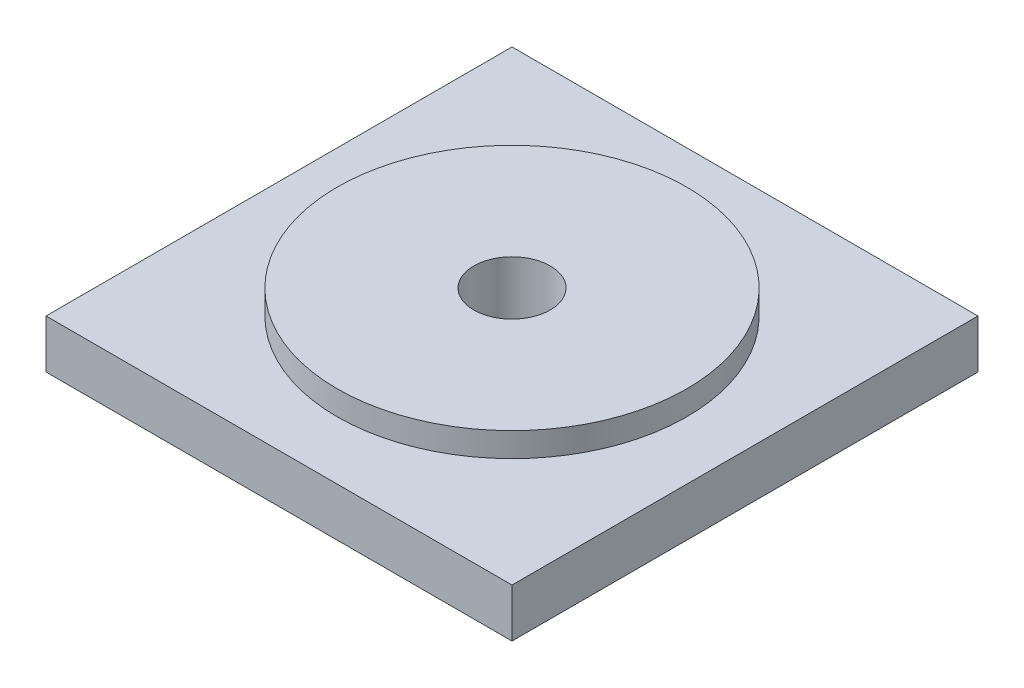
ISO-10303-21;
HEADER;
FILE_DESCRIPTION(('STEP AP214'),'2;1');
FILE_NAME('part.step','',(''),(''),'','','');
FILE_SCHEMA(('AUTOMOTIVE_DESIGN { 1 0 10303 214 1 1 1 1 }'));
ENDSEC;
DATA;
#1=APPLICATION_CONTEXT('core data for automotive mechanical design processes');
#2=APPLICATION_PROTOCOL_DEFINITION('international standard','automotive_design',2000,#1);
#3=PRODUCT_CONTEXT('',#1,'mechanical');
#4=PRODUCT('Part','Part','',(#3));
#5=PRODUCT_RELATED_PRODUCT_CATEGORY('part','',(#4));
#6=PRODUCT_DEFINITION_FORMATION('','',#4);
#7=PRODUCT_DEFINITION_CONTEXT('part definition',#1,'design');
#8=PRODUCT_DEFINITION('design','',#6,#7);
#9=PRODUCT_DEFINITION_SHAPE('','',#8);
#10=(LENGTH_UNIT() NAMED_UNIT(*) SI_UNIT(.MILLI.,.METRE.));
#11=(NAMED_UNIT(*) PLANE_ANGLE_UNIT() SI_UNIT($,.RADIAN.));
#12=(NAMED_UNIT(*) SI_UNIT($,.STERADIAN.) SOLID_ANGLE_UNIT());
#13=UNCERTAINTY_MEASURE_WITH_UNIT(LENGTH_MEASURE(1.E-05),#10,'distance_accuracy_value','');
#14=(GEOMETRIC_REPRESENTATION_CONTEXT(3) GLOBAL_UNCERTAINTY_ASSIGNED_CONTEXT((#13)) GLOBAL_UNIT_ASSIGNED_CONTEXT((#10,
#11,#12)) REPRESENTATION_CONTEXT('',''));
#15=CARTESIAN_POINT('',(0.,0.,0.));
#16=DIRECTION('',(0.,0.,1.));
#17=DIRECTION('',(1.,0.,0.));
#18=AXIS2_PLACEMENT_3D('',#15,#16,#17);
#19=CARTESIAN_POINT('',(0.,2.54,0.));
#20=DIRECTION('',(1.,0.,0.));
#21=DIRECTION('',(0.,0.,-1.));
#22=AXIS2_PLACEMENT_3D('',#19,#20,#21);
#23=PLANE('',#22);
#24=DIRECTION('',(0.,0.,1.));
#25=VECTOR('',#24,1.);
#26=CARTESIAN_POINT('',(0.,0.,0.));
#27=LINE('',#26,#25);
#28=CARTESIAN_POINT('',(0.,0.,0.));
#29=VERTEX_POINT('',#28);
#30=CARTESIAN_POINT('',(0.,0.,24.384));
#31=VERTEX_POINT('',#30);
#32=EDGE_CURVE('E99',#29,#31,#27,.T.);
#33=ORIENTED_EDGE('',*,*,#32,.T.);
#34=DIRECTION('',(0.,-1.,0.));
#35=VECTOR('',#34,1.);
#36=CARTESIAN_POINT('',(0.,2.54,24.384));
#37=LINE('',#36,#35);
#38=CARTESIAN_POINT('',(0.,2.54,24.384));
#39=VERTEX_POINT('',#38);
#40=EDGE_CURVE('E36',#39,#31,#37,.T.);
#41=ORIENTED_EDGE('',*,*,#40,.F.);
#42=DIRECTION('',(0.,0.,1.));
#43=VECTOR('',#42,1.);
#44=CARTESIAN_POINT('',(0.,2.54,0.));
#45=LINE('',#44,#43);
#46=CARTESIAN_POINT('',(0.,2.54,0.));
#47=VERTEX_POINT('',#46);
#48=EDGE_CURVE('E86',#47,#39,#45,.T.);
#49=ORIENTED_EDGE('',*,*,#48,.F.);
#50=DIRECTION('',(0.,-1.,0.));
#51=VECTOR('',#50,1.);
#52=CARTESIAN_POINT('',(0.,2.54,0.));
#53=LINE('',#52,#51);
#54=EDGE_CURVE('E95',#47,#29,#53,.T.);
#55=ORIENTED_EDGE('',*,*,#54,.T.);
#56=EDGE_LOOP('',(#33,#41,#49,#55));
#57=FACE_BOUND('',#56,.T.);
#58=ADVANCED_FACE('F33',(#57),#23,.F.);
#59=CARTESIAN_POINT('',(0.,2.54,24.384));
#60=DIRECTION('',(0.,0.,-1.));
#61=DIRECTION('',(-1.,0.,0.));
#62=AXIS2_PLACEMENT_3D('',#59,#60,#61);
#63=PLANE('',#62);
#64=DIRECTION('',(1.,0.,0.));
#65=VECTOR('',#64,1.);
#66=CARTESIAN_POINT('',(0.,0.,24.384));
#67=LINE('',#66,#65);
#68=CARTESIAN_POINT('',(24.384,0.,24.384));
#69=VERTEX_POINT('',#68);
#70=EDGE_CURVE('E91',#31,#69,#67,.T.);
#71=ORIENTED_EDGE('',*,*,#70,.T.);
#72=DIRECTION('',(0.,-1.,0.));
#73=VECTOR('',#72,1.);
#74=CARTESIAN_POINT('',(24.384,2.54,24.384));
#75=LINE('',#74,#73);
#76=CARTESIAN_POINT('',(24.384,2.54,24.384));
#77=VERTEX_POINT('',#76);
#78=EDGE_CURVE('E89',#77,#69,#75,.T.);
#79=ORIENTED_EDGE('',*,*,#78,.F.);
#80=DIRECTION('',(1.,0.,0.));
#81=VECTOR('',#80,1.);
#82=CARTESIAN_POINT('',(0.,2.54,24.384));
#83=LINE('',#82,#81);
#84=EDGE_CURVE('E81',#39,#77,#83,.T.);
#85=ORIENTED_EDGE('',*,*,#84,.F.);
#86=ORIENTED_EDGE('',*,*,#40,.T.);
#87=EDGE_LOOP('',(#71,#79,#85,#86));
#88=FACE_BOUND('',#87,.T.);
#89=ADVANCED_FACE('F90',(#88),#63,.F.);
#90=CARTESIAN_POINT('',(24.384,2.54,0.));
#91=DIRECTION('',(-1.,0.,0.));
#92=DIRECTION('',(0.,0.,1.));
#93=AXIS2_PLACEMENT_3D('',#90,#91,#92);
#94=PLANE('',#93);
#95=DIRECTION('',(0.,0.,-1.));
#96=VECTOR('',#95,1.);
#97=CARTESIAN_POINT('',(24.384,0.,0.));
#98=LINE('',#97,#96);
#99=CARTESIAN_POINT('',(24.384,0.,0.));
#100=VERTEX_POINT('',#99);
#101=EDGE_CURVE('E67',#69,#100,#98,.T.);
#102=ORIENTED_EDGE('',*,*,#101,.T.);
#103=DIRECTION('',(0.,-1.,0.));
#104=VECTOR('',#103,1.);
#105=CARTESIAN_POINT('',(24.384,2.54,0.));
#106=LINE('',#105,#104);
#107=CARTESIAN_POINT('',(24.384,2.54,0.));
#108=VERTEX_POINT('',#107);
#109=EDGE_CURVE('E92',#108,#100,#106,.T.);
#110=ORIENTED_EDGE('',*,*,#109,.F.);
#111=DIRECTION('',(0.,0.,-1.));
#112=VECTOR('',#111,1.);
#113=CARTESIAN_POINT('',(24.384,2.54,0.));
#114=LINE('',#113,#112);
#115=EDGE_CURVE('E84',#77,#108,#114,.T.);
#116=ORIENTED_EDGE('',*,*,#115,.F.);
#117=ORIENTED_EDGE('',*,*,#78,.T.);
#118=EDGE_LOOP('',(#102,#110,#116,#117));
#119=FACE_BOUND('',#118,.T.);
#120=ADVANCED_FACE('F93',(#119),#94,.F.);
#121=CARTESIAN_POINT('',(0.,2.54,0.));
#122=DIRECTION('',(0.,0.,1.));
#123=DIRECTION('',(1.,0.,0.));
#124=AXIS2_PLACEMENT_3D('',#121,#122,#123);
#125=PLANE('',#124);
#126=DIRECTION('',(-1.,0.,0.));
#127=VECTOR('',#126,1.);
#128=CARTESIAN_POINT('',(0.,0.,0.));
#129=LINE('',#128,#127);
#130=EDGE_CURVE('E73',#100,#29,#129,.T.);
#131=ORIENTED_EDGE('',*,*,#130,.T.);
#132=ORIENTED_EDGE('',*,*,#54,.F.);
#133=DIRECTION('',(-1.,0.,0.));
#134=VECTOR('',#133,1.);
#135=CARTESIAN_POINT('',(0.,2.54,0.));
#136=LINE('',#135,#134);
#137=EDGE_CURVE('E50',#108,#47,#136,.T.);
#138=ORIENTED_EDGE('',*,*,#137,.F.);
#139=ORIENTED_EDGE('',*,*,#109,.T.);
#140=EDGE_LOOP('',(#131,#132,#138,#139));
#141=FACE_BOUND('',#140,.T.);
#142=ADVANCED_FACE('F107',(#141),#125,.F.);
#143=CARTESIAN_POINT('',(0.,2.54,0.));
#144=DIRECTION('',(0.,1.,0.));
#145=DIRECTION('',(0.,0.,1.));
#146=AXIS2_PLACEMENT_3D('',#143,#144,#145);
#147=PLANE('',#146);
#148=CARTESIAN_POINT('',(12.192,2.54,12.192));
#149=DIRECTION('',(0.,1.,0.));
#150=DIRECTION('',(0.,0.,1.));
#151=AXIS2_PLACEMENT_3D('',#148,#149,#150);
#152=CIRCLE('',#151,9.14399999999999);
#153=CARTESIAN_POINT('',(12.192,2.54,21.336));
#154=VERTEX_POINT('',#153);
#155=EDGE_CURVE('E11',#154,#154,#152,.T.);
#156=ORIENTED_EDGE('',*,*,#155,.F.);
#157=EDGE_LOOP('',(#156));
#158=FACE_BOUND('',#157,.T.);
#159=ORIENTED_EDGE('',*,*,#48,.T.);
#160=ORIENTED_EDGE('',*,*,#84,.T.);
#161=ORIENTED_EDGE('',*,*,#115,.T.);
#162=ORIENTED_EDGE('',*,*,#137,.T.);
#163=EDGE_LOOP('',(#159,#160,#161,#162));
#164=FACE_BOUND('',#163,.T.);
#165=ADVANCED_FACE('F82',(#158,#164),#147,.T.);
#166=CARTESIAN_POINT('',(0.,0.,0.));
#167=DIRECTION('',(0.,1.,0.));
#168=DIRECTION('',(0.,0.,1.));
#169=AXIS2_PLACEMENT_3D('',#166,#167,#168);
#170=PLANE('',#169);
#171=CARTESIAN_POINT('',(12.192,0.,12.192));
#172=DIRECTION('',(0.,1.,0.));
#173=DIRECTION('',(0.,0.,1.));
#174=AXIS2_PLACEMENT_3D('',#171,#172,#173);
#175=CIRCLE('',#174,2.);
#176=CARTESIAN_POINT('',(12.192,0.,14.192));
#177=VERTEX_POINT('',#176);
#178=EDGE_CURVE('E115',#177,#177,#175,.T.);
#179=ORIENTED_EDGE('',*,*,#178,.T.);
#180=EDGE_LOOP('',(#179));
#181=FACE_BOUND('',#180,.T.);
#182=ORIENTED_EDGE('',*,*,#32,.F.);
#183=ORIENTED_EDGE('',*,*,#130,.F.);
#184=ORIENTED_EDGE('',*,*,#101,.F.);
#185=ORIENTED_EDGE('',*,*,#70,.F.);
#186=EDGE_LOOP('',(#182,#183,#184,#185));
#187=FACE_BOUND('',#186,.T.);
#188=ADVANCED_FACE('F110',(#181,#187),#170,.F.);
#189=CARTESIAN_POINT('',(12.192,3.81,12.192));
#190=DIRECTION('',(0.,-1.,0.));
#191=DIRECTION('',(0.,0.,-1.));
#192=AXIS2_PLACEMENT_3D('',#189,#190,#191);
#193=CYLINDRICAL_SURFACE('',#192,9.14399999999999);
#194=CARTESIAN_POINT('',(12.192,3.81,12.192));
#195=DIRECTION('',(0.,1.,0.));
#196=DIRECTION('',(0.,0.,1.));
#197=AXIS2_PLACEMENT_3D('',#194,#195,#196);
#198=CIRCLE('',#197,9.14399999999999);
#199=CARTESIAN_POINT('',(12.192,3.81,21.336));
#200=VERTEX_POINT('',#199);
#201=EDGE_CURVE('E102',#200,#200,#198,.T.);
#202=ORIENTED_EDGE('',*,*,#201,.F.);
#203=EDGE_LOOP('',(#202));
#204=FACE_BOUND('',#203,.T.);
#205=ORIENTED_EDGE('',*,*,#155,.T.);
#206=EDGE_LOOP('',(#205));
#207=FACE_BOUND('',#206,.T.);
#208=ADVANCED_FACE('F132',(#204,#207),#193,.T.);
#209=CARTESIAN_POINT('',(12.192,3.81,12.192));
#210=DIRECTION('',(0.,1.,0.));
#211=DIRECTION('',(0.,0.,1.));
#212=AXIS2_PLACEMENT_3D('',#209,#210,#211);
#213=PLANE('',#212);
#214=CARTESIAN_POINT('',(12.192,3.81,12.192));
#215=DIRECTION('',(0.,1.,0.));
#216=DIRECTION('',(0.,0.,1.));
#217=AXIS2_PLACEMENT_3D('',#214,#215,#216);
#218=CIRCLE('',#217,2.);
#219=CARTESIAN_POINT('',(12.192,3.81,14.192));
#220=VERTEX_POINT('',#219);
#221=EDGE_CURVE('E116',#220,#220,#218,.T.);
#222=ORIENTED_EDGE('',*,*,#221,.F.);
#223=EDGE_LOOP('',(#222));
#224=FACE_BOUND('',#223,.T.);
#225=ORIENTED_EDGE('',*,*,#201,.T.);
#226=EDGE_LOOP('',(#225));
#227=FACE_BOUND('',#226,.T.);
#228=ADVANCED_FACE('F126',(#224,#227),#213,.T.);
#229=CARTESIAN_POINT('',(12.192,0.,12.192));
#230=DIRECTION('',(0.,1.,0.));
#231=DIRECTION('',(0.,0.,1.));
#232=AXIS2_PLACEMENT_3D('',#229,#230,#231);
#233=CYLINDRICAL_SURFACE('',#232,2.);
#234=ORIENTED_EDGE('',*,*,#178,.F.);
#235=EDGE_LOOP('',(#234));
#236=FACE_BOUND('',#235,.T.);
#237=ORIENTED_EDGE('',*,*,#221,.T.);
#238=EDGE_LOOP('',(#237));
#239=FACE_BOUND('',#238,.T.);
#240=ADVANCED_FACE('F123',(#236,#239),#233,.F.);
#241=CLOSED_SHELL('',(#58,#89,#120,#142,#165,#188,#208,#228,#240));
#242=MANIFOLD_SOLID_BREP('B2',#241);
#243=ADVANCED_BREP_SHAPE_REPRESENTATION('',(#18,#242),#14);
#244=SHAPE_DEFINITION_REPRESENTATION(#9,#243);
ENDSEC;
END-ISO-10303-21;
